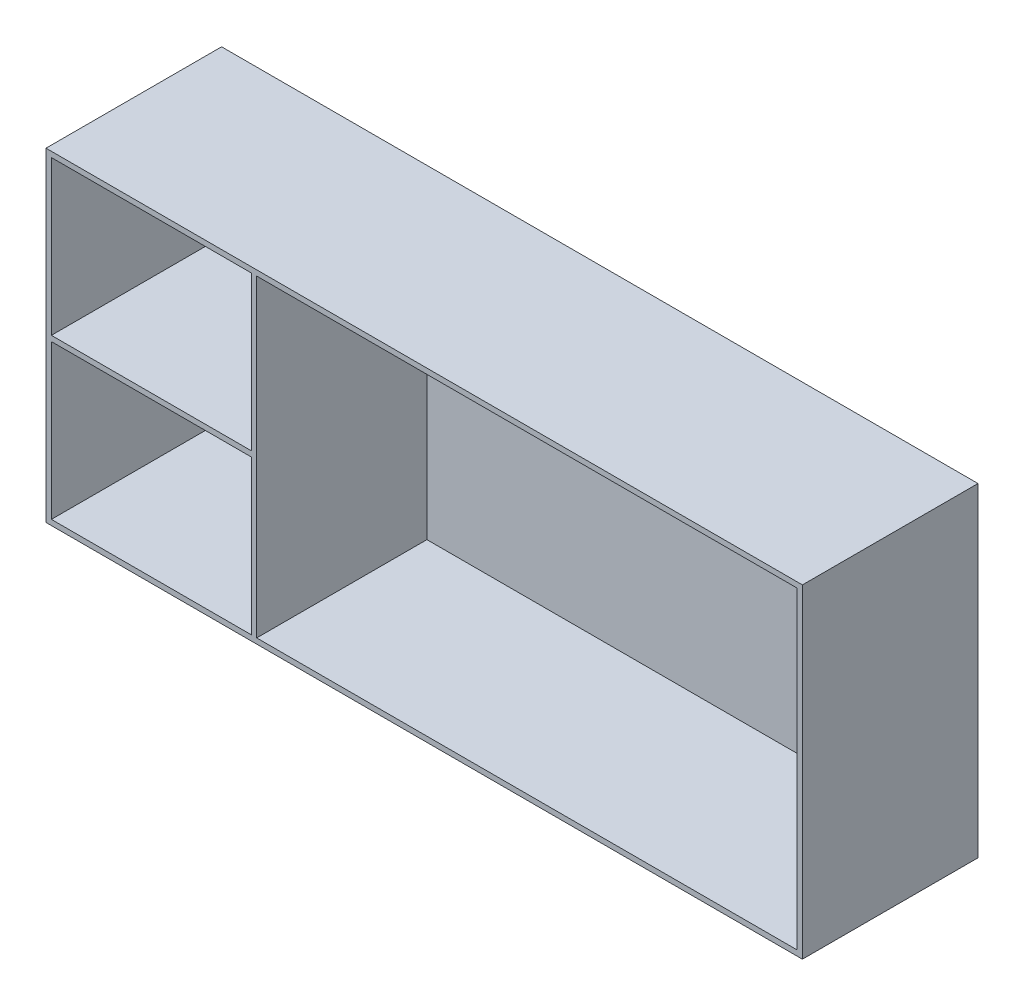
ISO-10303-21;
HEADER;
FILE_DESCRIPTION(('STEP AP214'),'2;1');
FILE_NAME('part.step','',(''),(''),'','','');
FILE_SCHEMA(('AUTOMOTIVE_DESIGN { 1 0 10303 214 1 1 1 1 }'));
ENDSEC;
DATA;
#1=APPLICATION_CONTEXT('core data for automotive mechanical design processes');
#2=APPLICATION_PROTOCOL_DEFINITION('international standard','automotive_design',2000,#1);
#3=PRODUCT_CONTEXT('',#1,'mechanical');
#4=PRODUCT('Part','Part','',(#3));
#5=PRODUCT_RELATED_PRODUCT_CATEGORY('part','',(#4));
#6=PRODUCT_DEFINITION_FORMATION('','',#4);
#7=PRODUCT_DEFINITION_CONTEXT('part definition',#1,'design');
#8=PRODUCT_DEFINITION('design','',#6,#7);
#9=PRODUCT_DEFINITION_SHAPE('','',#8);
#10=(LENGTH_UNIT() NAMED_UNIT(*) SI_UNIT(.MILLI.,.METRE.));
#11=(NAMED_UNIT(*) PLANE_ANGLE_UNIT() SI_UNIT($,.RADIAN.));
#12=(NAMED_UNIT(*) SI_UNIT($,.STERADIAN.) SOLID_ANGLE_UNIT());
#13=UNCERTAINTY_MEASURE_WITH_UNIT(LENGTH_MEASURE(1.E-05),#10,'distance_accuracy_value','');
#14=(GEOMETRIC_REPRESENTATION_CONTEXT(3) GLOBAL_UNCERTAINTY_ASSIGNED_CONTEXT((#13)) GLOBAL_UNIT_ASSIGNED_CONTEXT((#10,
#11,#12)) REPRESENTATION_CONTEXT('',''));
#15=CARTESIAN_POINT('',(0.,0.,0.));
#16=DIRECTION('',(0.,0.,1.));
#17=DIRECTION('',(1.,0.,0.));
#18=AXIS2_PLACEMENT_3D('',#15,#16,#17);
#19=CARTESIAN_POINT('',(0.,0.,65.));
#20=DIRECTION('',(0.,0.,-1.));
#21=DIRECTION('',(-1.,0.,0.));
#22=AXIS2_PLACEMENT_3D('',#19,#20,#21);
#23=PLANE('',#22);
#24=DIRECTION('',(1.,0.,0.));
#25=VECTOR('',#24,1.);
#26=CARTESIAN_POINT('',(0.,0.999999999999996,65.));
#27=LINE('',#26,#25);
#28=CARTESIAN_POINT('',(-138.,0.999999999999996,65.));
#29=VERTEX_POINT('',#28);
#30=CARTESIAN_POINT('',(-64.,0.999999999999996,65.));
#31=VERTEX_POINT('',#30);
#32=EDGE_CURVE('E175',#29,#31,#27,.T.);
#33=ORIENTED_EDGE('',*,*,#32,.F.);
#34=DIRECTION('',(0.,-1.,0.));
#35=VECTOR('',#34,1.);
#36=CARTESIAN_POINT('',(-138.,0.,65.));
#37=LINE('',#36,#35);
#38=CARTESIAN_POINT('',(-138.,58.,65.));
#39=VERTEX_POINT('',#38);
#40=EDGE_CURVE('E48',#39,#29,#37,.T.);
#41=ORIENTED_EDGE('',*,*,#40,.F.);
#42=DIRECTION('',(1.,0.,0.));
#43=VECTOR('',#42,1.);
#44=CARTESIAN_POINT('',(0.,58.,65.));
#45=LINE('',#44,#43);
#46=CARTESIAN_POINT('',(-64.,58.,65.));
#47=VERTEX_POINT('',#46);
#48=EDGE_CURVE('E166',#39,#47,#45,.T.);
#49=ORIENTED_EDGE('',*,*,#48,.T.);
#50=DIRECTION('',(0.,1.,0.));
#51=VECTOR('',#50,1.);
#52=CARTESIAN_POINT('',(-64.,0.,65.));
#53=LINE('',#52,#51);
#54=EDGE_CURVE('E169',#31,#47,#53,.T.);
#55=ORIENTED_EDGE('',*,*,#54,.F.);
#56=EDGE_LOOP('',(#33,#41,#49,#55));
#57=FACE_BOUND('',#56,.T.);
#58=DIRECTION('',(1.,0.,0.));
#59=VECTOR('',#58,1.);
#60=CARTESIAN_POINT('',(0.,-1.,65.));
#61=LINE('',#60,#59);
#62=CARTESIAN_POINT('',(-138.,-1.,65.));
#63=VERTEX_POINT('',#62);
#64=CARTESIAN_POINT('',(-64.,-1.,65.));
#65=VERTEX_POINT('',#64);
#66=EDGE_CURVE('E182',#63,#65,#61,.T.);
#67=ORIENTED_EDGE('',*,*,#66,.T.);
#68=DIRECTION('',(0.,1.,0.));
#69=VECTOR('',#68,1.);
#70=CARTESIAN_POINT('',(-64.,0.,65.));
#71=LINE('',#70,#69);
#72=CARTESIAN_POINT('',(-64.,-58.,65.));
#73=VERTEX_POINT('',#72);
#74=EDGE_CURVE('E216',#73,#65,#71,.T.);
#75=ORIENTED_EDGE('',*,*,#74,.F.);
#76=DIRECTION('',(1.,0.,0.));
#77=VECTOR('',#76,1.);
#78=CARTESIAN_POINT('',(0.,-58.,65.));
#79=LINE('',#78,#77);
#80=CARTESIAN_POINT('',(-138.,-58.,65.));
#81=VERTEX_POINT('',#80);
#82=EDGE_CURVE('E231',#81,#73,#79,.T.);
#83=ORIENTED_EDGE('',*,*,#82,.F.);
#84=DIRECTION('',(0.,-1.,0.));
#85=VECTOR('',#84,1.);
#86=CARTESIAN_POINT('',(-138.,0.,65.));
#87=LINE('',#86,#85);
#88=EDGE_CURVE('E228',#63,#81,#87,.T.);
#89=ORIENTED_EDGE('',*,*,#88,.F.);
#90=EDGE_LOOP('',(#67,#75,#83,#89));
#91=FACE_BOUND('',#90,.T.);
#92=DIRECTION('',(0.,-1.,0.));
#93=VECTOR('',#92,1.);
#94=CARTESIAN_POINT('',(-140.,60.,65.));
#95=LINE('',#94,#93);
#96=CARTESIAN_POINT('',(-140.,60.,65.));
#97=VERTEX_POINT('',#96);
#98=CARTESIAN_POINT('',(-140.,-60.,65.));
#99=VERTEX_POINT('',#98);
#100=EDGE_CURVE('E245',#97,#99,#95,.T.);
#101=ORIENTED_EDGE('',*,*,#100,.T.);
#102=DIRECTION('',(1.,0.,0.));
#103=VECTOR('',#102,1.);
#104=CARTESIAN_POINT('',(140.,-60.,65.));
#105=LINE('',#104,#103);
#106=CARTESIAN_POINT('',(140.,-60.,65.));
#107=VERTEX_POINT('',#106);
#108=EDGE_CURVE('E248',#99,#107,#105,.T.);
#109=ORIENTED_EDGE('',*,*,#108,.T.);
#110=DIRECTION('',(0.,1.,0.));
#111=VECTOR('',#110,1.);
#112=CARTESIAN_POINT('',(140.,60.,65.));
#113=LINE('',#112,#111);
#114=CARTESIAN_POINT('',(140.,60.,65.));
#115=VERTEX_POINT('',#114);
#116=EDGE_CURVE('E251',#107,#115,#113,.T.);
#117=ORIENTED_EDGE('',*,*,#116,.T.);
#118=DIRECTION('',(-1.,0.,0.));
#119=VECTOR('',#118,1.);
#120=CARTESIAN_POINT('',(140.,60.,65.));
#121=LINE('',#120,#119);
#122=EDGE_CURVE('E253',#115,#97,#121,.T.);
#123=ORIENTED_EDGE('',*,*,#122,.T.);
#124=EDGE_LOOP('',(#101,#109,#117,#123));
#125=FACE_BOUND('',#124,.T.);
#126=DIRECTION('',(0.,1.,0.));
#127=VECTOR('',#126,1.);
#128=CARTESIAN_POINT('',(-62.,0.,65.));
#129=LINE('',#128,#127);
#130=CARTESIAN_POINT('',(-62.,-58.,65.));
#131=VERTEX_POINT('',#130);
#132=CARTESIAN_POINT('',(-62.,58.,65.));
#133=VERTEX_POINT('',#132);
#134=EDGE_CURVE('E56',#131,#133,#129,.T.);
#135=ORIENTED_EDGE('',*,*,#134,.T.);
#136=DIRECTION('',(1.,0.,0.));
#137=VECTOR('',#136,1.);
#138=CARTESIAN_POINT('',(0.,58.,65.));
#139=LINE('',#138,#137);
#140=CARTESIAN_POINT('',(138.,58.,65.));
#141=VERTEX_POINT('',#140);
#142=EDGE_CURVE('E190',#133,#141,#139,.T.);
#143=ORIENTED_EDGE('',*,*,#142,.T.);
#144=DIRECTION('',(0.,-1.,0.));
#145=VECTOR('',#144,1.);
#146=CARTESIAN_POINT('',(138.,0.,65.));
#147=LINE('',#146,#145);
#148=CARTESIAN_POINT('',(138.,-58.,65.));
#149=VERTEX_POINT('',#148);
#150=EDGE_CURVE('E202',#141,#149,#147,.T.);
#151=ORIENTED_EDGE('',*,*,#150,.T.);
#152=DIRECTION('',(1.,0.,0.));
#153=VECTOR('',#152,1.);
#154=CARTESIAN_POINT('',(0.,-58.,65.));
#155=LINE('',#154,#153);
#156=EDGE_CURVE('E199',#131,#149,#155,.T.);
#157=ORIENTED_EDGE('',*,*,#156,.F.);
#158=EDGE_LOOP('',(#135,#143,#151,#157));
#159=FACE_BOUND('',#158,.T.);
#160=ADVANCED_FACE('F33',(#57,#91,#125,#159),#23,.F.);
#161=CARTESIAN_POINT('',(-140.,60.,65.));
#162=DIRECTION('',(1.,0.,0.));
#163=DIRECTION('',(0.,1.,0.));
#164=AXIS2_PLACEMENT_3D('',#161,#162,#163);
#165=PLANE('',#164);
#166=DIRECTION('',(0.,-1.,0.));
#167=VECTOR('',#166,1.);
#168=CARTESIAN_POINT('',(-140.,60.,0.));
#169=LINE('',#168,#167);
#170=CARTESIAN_POINT('',(-140.,60.,0.));
#171=VERTEX_POINT('',#170);
#172=CARTESIAN_POINT('',(-140.,-60.,0.));
#173=VERTEX_POINT('',#172);
#174=EDGE_CURVE('E238',#171,#173,#169,.T.);
#175=ORIENTED_EDGE('',*,*,#174,.T.);
#176=DIRECTION('',(0.,0.,-1.));
#177=VECTOR('',#176,1.);
#178=CARTESIAN_POINT('',(-140.,-60.,65.));
#179=LINE('',#178,#177);
#180=EDGE_CURVE('E11',#99,#173,#179,.T.);
#181=ORIENTED_EDGE('',*,*,#180,.F.);
#182=ORIENTED_EDGE('',*,*,#100,.F.);
#183=DIRECTION('',(0.,0.,-1.));
#184=VECTOR('',#183,1.);
#185=CARTESIAN_POINT('',(-140.,60.,65.));
#186=LINE('',#185,#184);
#187=EDGE_CURVE('E255',#97,#171,#186,.T.);
#188=ORIENTED_EDGE('',*,*,#187,.T.);
#189=EDGE_LOOP('',(#175,#181,#182,#188));
#190=FACE_BOUND('',#189,.T.);
#191=ADVANCED_FACE('F35',(#190),#165,.F.);
#192=CARTESIAN_POINT('',(140.,-60.,65.));
#193=DIRECTION('',(0.,1.,0.));
#194=DIRECTION('',(-1.,0.,0.));
#195=AXIS2_PLACEMENT_3D('',#192,#193,#194);
#196=PLANE('',#195);
#197=DIRECTION('',(1.,0.,0.));
#198=VECTOR('',#197,1.);
#199=CARTESIAN_POINT('',(140.,-60.,0.));
#200=LINE('',#199,#198);
#201=CARTESIAN_POINT('',(140.,-60.,0.));
#202=VERTEX_POINT('',#201);
#203=EDGE_CURVE('E258',#173,#202,#200,.T.);
#204=ORIENTED_EDGE('',*,*,#203,.T.);
#205=DIRECTION('',(0.,0.,-1.));
#206=VECTOR('',#205,1.);
#207=CARTESIAN_POINT('',(140.,-60.,65.));
#208=LINE('',#207,#206);
#209=EDGE_CURVE('E41',#107,#202,#208,.T.);
#210=ORIENTED_EDGE('',*,*,#209,.F.);
#211=ORIENTED_EDGE('',*,*,#108,.F.);
#212=ORIENTED_EDGE('',*,*,#180,.T.);
#213=EDGE_LOOP('',(#204,#210,#211,#212));
#214=FACE_BOUND('',#213,.T.);
#215=ADVANCED_FACE('F288',(#214),#196,.F.);
#216=CARTESIAN_POINT('',(140.,60.,65.));
#217=DIRECTION('',(-1.,0.,0.));
#218=DIRECTION('',(0.,0.,1.));
#219=AXIS2_PLACEMENT_3D('',#216,#217,#218);
#220=PLANE('',#219);
#221=DIRECTION('',(0.,1.,0.));
#222=VECTOR('',#221,1.);
#223=CARTESIAN_POINT('',(140.,60.,0.));
#224=LINE('',#223,#222);
#225=CARTESIAN_POINT('',(140.,60.,0.));
#226=VERTEX_POINT('',#225);
#227=EDGE_CURVE('E260',#202,#226,#224,.T.);
#228=ORIENTED_EDGE('',*,*,#227,.T.);
#229=DIRECTION('',(0.,0.,-1.));
#230=VECTOR('',#229,1.);
#231=CARTESIAN_POINT('',(140.,60.,65.));
#232=LINE('',#231,#230);
#233=EDGE_CURVE('E265',#115,#226,#232,.T.);
#234=ORIENTED_EDGE('',*,*,#233,.F.);
#235=ORIENTED_EDGE('',*,*,#116,.F.);
#236=ORIENTED_EDGE('',*,*,#209,.T.);
#237=EDGE_LOOP('',(#228,#234,#235,#236));
#238=FACE_BOUND('',#237,.T.);
#239=ADVANCED_FACE('F272',(#238),#220,.F.);
#240=CARTESIAN_POINT('',(140.,60.,65.));
#241=DIRECTION('',(0.,-1.,0.));
#242=DIRECTION('',(1.,0.,0.));
#243=AXIS2_PLACEMENT_3D('',#240,#241,#242);
#244=PLANE('',#243);
#245=DIRECTION('',(-1.,0.,0.));
#246=VECTOR('',#245,1.);
#247=CARTESIAN_POINT('',(140.,60.,0.));
#248=LINE('',#247,#246);
#249=EDGE_CURVE('E249',#226,#171,#248,.T.);
#250=ORIENTED_EDGE('',*,*,#249,.T.);
#251=ORIENTED_EDGE('',*,*,#187,.F.);
#252=ORIENTED_EDGE('',*,*,#122,.F.);
#253=ORIENTED_EDGE('',*,*,#233,.T.);
#254=EDGE_LOOP('',(#250,#251,#252,#253));
#255=FACE_BOUND('',#254,.T.);
#256=ADVANCED_FACE('F281',(#255),#244,.F.);
#257=CARTESIAN_POINT('',(0.,0.,0.));
#258=DIRECTION('',(0.,0.,-1.));
#259=DIRECTION('',(-1.,0.,0.));
#260=AXIS2_PLACEMENT_3D('',#257,#258,#259);
#261=PLANE('',#260);
#262=ORIENTED_EDGE('',*,*,#174,.F.);
#263=ORIENTED_EDGE('',*,*,#249,.F.);
#264=ORIENTED_EDGE('',*,*,#227,.F.);
#265=ORIENTED_EDGE('',*,*,#203,.F.);
#266=EDGE_LOOP('',(#262,#263,#264,#265));
#267=FACE_BOUND('',#266,.T.);
#268=ADVANCED_FACE('F278',(#267),#261,.T.);
#269=CARTESIAN_POINT('',(0.,-1.,2.));
#270=DIRECTION('',(0.,-1.,0.));
#271=DIRECTION('',(0.,0.,-1.));
#272=AXIS2_PLACEMENT_3D('',#269,#270,#271);
#273=PLANE('',#272);
#274=ORIENTED_EDGE('',*,*,#66,.F.);
#275=DIRECTION('',(0.,0.,1.));
#276=VECTOR('',#275,1.);
#277=CARTESIAN_POINT('',(-138.,-1.,2.));
#278=LINE('',#277,#276);
#279=CARTESIAN_POINT('',(-138.,-1.,2.));
#280=VERTEX_POINT('',#279);
#281=EDGE_CURVE('E225',#280,#63,#278,.T.);
#282=ORIENTED_EDGE('',*,*,#281,.F.);
#283=DIRECTION('',(1.,0.,0.));
#284=VECTOR('',#283,1.);
#285=CARTESIAN_POINT('',(0.,-1.,2.));
#286=LINE('',#285,#284);
#287=CARTESIAN_POINT('',(-64.,-1.,2.));
#288=VERTEX_POINT('',#287);
#289=EDGE_CURVE('E213',#280,#288,#286,.T.);
#290=ORIENTED_EDGE('',*,*,#289,.T.);
#291=DIRECTION('',(0.,0.,1.));
#292=VECTOR('',#291,1.);
#293=CARTESIAN_POINT('',(-64.,-1.,2.));
#294=LINE('',#293,#292);
#295=EDGE_CURVE('E236',#288,#65,#294,.T.);
#296=ORIENTED_EDGE('',*,*,#295,.T.);
#297=EDGE_LOOP('',(#274,#282,#290,#296));
#298=FACE_BOUND('',#297,.T.);
#299=ADVANCED_FACE('F303',(#298),#273,.T.);
#300=CARTESIAN_POINT('',(-64.,0.,2.));
#301=DIRECTION('',(1.,0.,0.));
#302=DIRECTION('',(0.,0.,-1.));
#303=AXIS2_PLACEMENT_3D('',#300,#301,#302);
#304=PLANE('',#303);
#305=ORIENTED_EDGE('',*,*,#74,.T.);
#306=ORIENTED_EDGE('',*,*,#295,.F.);
#307=DIRECTION('',(0.,1.,0.));
#308=VECTOR('',#307,1.);
#309=CARTESIAN_POINT('',(-64.,0.,2.));
#310=LINE('',#309,#308);
#311=CARTESIAN_POINT('',(-64.,-58.,2.));
#312=VERTEX_POINT('',#311);
#313=EDGE_CURVE('E222',#312,#288,#310,.T.);
#314=ORIENTED_EDGE('',*,*,#313,.F.);
#315=DIRECTION('',(0.,0.,1.));
#316=VECTOR('',#315,1.);
#317=CARTESIAN_POINT('',(-64.,-58.,2.));
#318=LINE('',#317,#316);
#319=EDGE_CURVE('E239',#312,#73,#318,.T.);
#320=ORIENTED_EDGE('',*,*,#319,.T.);
#321=EDGE_LOOP('',(#305,#306,#314,#320));
#322=FACE_BOUND('',#321,.T.);
#323=ADVANCED_FACE('F322',(#322),#304,.F.);
#324=CARTESIAN_POINT('',(0.,-58.,2.));
#325=DIRECTION('',(0.,-1.,0.));
#326=DIRECTION('',(0.,0.,-1.));
#327=AXIS2_PLACEMENT_3D('',#324,#325,#326);
#328=PLANE('',#327);
#329=ORIENTED_EDGE('',*,*,#82,.T.);
#330=ORIENTED_EDGE('',*,*,#319,.F.);
#331=DIRECTION('',(1.,0.,0.));
#332=VECTOR('',#331,1.);
#333=CARTESIAN_POINT('',(0.,-58.,2.));
#334=LINE('',#333,#332);
#335=CARTESIAN_POINT('',(-138.,-58.,2.));
#336=VERTEX_POINT('',#335);
#337=EDGE_CURVE('E219',#336,#312,#334,.T.);
#338=ORIENTED_EDGE('',*,*,#337,.F.);
#339=DIRECTION('',(0.,0.,1.));
#340=VECTOR('',#339,1.);
#341=CARTESIAN_POINT('',(-138.,-58.,2.));
#342=LINE('',#341,#340);
#343=EDGE_CURVE('E241',#336,#81,#342,.T.);
#344=ORIENTED_EDGE('',*,*,#343,.T.);
#345=EDGE_LOOP('',(#329,#330,#338,#344));
#346=FACE_BOUND('',#345,.T.);
#347=ADVANCED_FACE('F329',(#346),#328,.F.);
#348=CARTESIAN_POINT('',(-138.,0.,2.));
#349=DIRECTION('',(-1.,0.,0.));
#350=DIRECTION('',(0.,-1.,0.));
#351=AXIS2_PLACEMENT_3D('',#348,#349,#350);
#352=PLANE('',#351);
#353=ORIENTED_EDGE('',*,*,#88,.T.);
#354=ORIENTED_EDGE('',*,*,#343,.F.);
#355=DIRECTION('',(0.,-1.,0.));
#356=VECTOR('',#355,1.);
#357=CARTESIAN_POINT('',(-138.,0.,2.));
#358=LINE('',#357,#356);
#359=EDGE_CURVE('E215',#280,#336,#358,.T.);
#360=ORIENTED_EDGE('',*,*,#359,.F.);
#361=ORIENTED_EDGE('',*,*,#281,.T.);
#362=EDGE_LOOP('',(#353,#354,#360,#361));
#363=FACE_BOUND('',#362,.T.);
#364=ADVANCED_FACE('F337',(#363),#352,.F.);
#365=CARTESIAN_POINT('',(0.,0.,2.));
#366=DIRECTION('',(0.,0.,1.));
#367=DIRECTION('',(1.,0.,0.));
#368=AXIS2_PLACEMENT_3D('',#365,#366,#367);
#369=PLANE('',#368);
#370=ORIENTED_EDGE('',*,*,#289,.F.);
#371=ORIENTED_EDGE('',*,*,#359,.T.);
#372=ORIENTED_EDGE('',*,*,#337,.T.);
#373=ORIENTED_EDGE('',*,*,#313,.T.);
#374=EDGE_LOOP('',(#370,#371,#372,#373));
#375=FACE_BOUND('',#374,.T.);
#376=ADVANCED_FACE('F345',(#375),#369,.T.);
#377=CARTESIAN_POINT('',(-62.,0.,2.));
#378=DIRECTION('',(1.,0.,0.));
#379=DIRECTION('',(0.,0.,-1.));
#380=AXIS2_PLACEMENT_3D('',#377,#378,#379);
#381=PLANE('',#380);
#382=ORIENTED_EDGE('',*,*,#134,.F.);
#383=DIRECTION('',(0.,0.,1.));
#384=VECTOR('',#383,1.);
#385=CARTESIAN_POINT('',(-62.,-58.,2.));
#386=LINE('',#385,#384);
#387=CARTESIAN_POINT('',(-62.,-58.,2.));
#388=VERTEX_POINT('',#387);
#389=EDGE_CURVE('E197',#388,#131,#386,.T.);
#390=ORIENTED_EDGE('',*,*,#389,.F.);
#391=DIRECTION('',(0.,1.,0.));
#392=VECTOR('',#391,1.);
#393=CARTESIAN_POINT('',(-62.,0.,2.));
#394=LINE('',#393,#392);
#395=CARTESIAN_POINT('',(-62.,58.,2.));
#396=VERTEX_POINT('',#395);
#397=EDGE_CURVE('E186',#388,#396,#394,.T.);
#398=ORIENTED_EDGE('',*,*,#397,.T.);
#399=DIRECTION('',(0.,0.,1.));
#400=VECTOR('',#399,1.);
#401=CARTESIAN_POINT('',(-62.,58.,2.));
#402=LINE('',#401,#400);
#403=EDGE_CURVE('E176',#396,#133,#402,.T.);
#404=ORIENTED_EDGE('',*,*,#403,.T.);
#405=EDGE_LOOP('',(#382,#390,#398,#404));
#406=FACE_BOUND('',#405,.T.);
#407=ADVANCED_FACE('F352',(#406),#381,.T.);
#408=CARTESIAN_POINT('',(0.,58.,2.));
#409=DIRECTION('',(0.,-1.,0.));
#410=DIRECTION('',(0.,0.,-1.));
#411=AXIS2_PLACEMENT_3D('',#408,#409,#410);
#412=PLANE('',#411);
#413=ORIENTED_EDGE('',*,*,#142,.F.);
#414=ORIENTED_EDGE('',*,*,#403,.F.);
#415=DIRECTION('',(1.,0.,0.));
#416=VECTOR('',#415,1.);
#417=CARTESIAN_POINT('',(0.,58.,2.));
#418=LINE('',#417,#416);
#419=CARTESIAN_POINT('',(138.,58.,2.));
#420=VERTEX_POINT('',#419);
#421=EDGE_CURVE('E195',#396,#420,#418,.T.);
#422=ORIENTED_EDGE('',*,*,#421,.T.);
#423=DIRECTION('',(0.,0.,1.));
#424=VECTOR('',#423,1.);
#425=CARTESIAN_POINT('',(138.,58.,2.));
#426=LINE('',#425,#424);
#427=EDGE_CURVE('E208',#420,#141,#426,.T.);
#428=ORIENTED_EDGE('',*,*,#427,.T.);
#429=EDGE_LOOP('',(#413,#414,#422,#428));
#430=FACE_BOUND('',#429,.T.);
#431=ADVANCED_FACE('F360',(#430),#412,.T.);
#432=CARTESIAN_POINT('',(138.,0.,2.));
#433=DIRECTION('',(-1.,0.,0.));
#434=DIRECTION('',(0.,-1.,0.));
#435=AXIS2_PLACEMENT_3D('',#432,#433,#434);
#436=PLANE('',#435);
#437=ORIENTED_EDGE('',*,*,#150,.F.);
#438=ORIENTED_EDGE('',*,*,#427,.F.);
#439=DIRECTION('',(0.,-1.,0.));
#440=VECTOR('',#439,1.);
#441=CARTESIAN_POINT('',(138.,0.,2.));
#442=LINE('',#441,#440);
#443=CARTESIAN_POINT('',(138.,-58.,2.));
#444=VERTEX_POINT('',#443);
#445=EDGE_CURVE('E193',#420,#444,#442,.T.);
#446=ORIENTED_EDGE('',*,*,#445,.T.);
#447=DIRECTION('',(0.,0.,1.));
#448=VECTOR('',#447,1.);
#449=CARTESIAN_POINT('',(138.,-58.,2.));
#450=LINE('',#449,#448);
#451=EDGE_CURVE('E210',#444,#149,#450,.T.);
#452=ORIENTED_EDGE('',*,*,#451,.T.);
#453=EDGE_LOOP('',(#437,#438,#446,#452));
#454=FACE_BOUND('',#453,.T.);
#455=ADVANCED_FACE('F367',(#454),#436,.T.);
#456=CARTESIAN_POINT('',(0.,-58.,2.));
#457=DIRECTION('',(0.,-1.,0.));
#458=DIRECTION('',(0.,0.,-1.));
#459=AXIS2_PLACEMENT_3D('',#456,#457,#458);
#460=PLANE('',#459);
#461=ORIENTED_EDGE('',*,*,#156,.T.);
#462=ORIENTED_EDGE('',*,*,#451,.F.);
#463=DIRECTION('',(1.,0.,0.));
#464=VECTOR('',#463,1.);
#465=CARTESIAN_POINT('',(0.,-58.,2.));
#466=LINE('',#465,#464);
#467=EDGE_CURVE('E189',#388,#444,#466,.T.);
#468=ORIENTED_EDGE('',*,*,#467,.F.);
#469=ORIENTED_EDGE('',*,*,#389,.T.);
#470=EDGE_LOOP('',(#461,#462,#468,#469));
#471=FACE_BOUND('',#470,.T.);
#472=ADVANCED_FACE('F375',(#471),#460,.F.);
#473=CARTESIAN_POINT('',(0.,0.,2.));
#474=DIRECTION('',(0.,0.,1.));
#475=DIRECTION('',(1.,0.,0.));
#476=AXIS2_PLACEMENT_3D('',#473,#474,#475);
#477=PLANE('',#476);
#478=ORIENTED_EDGE('',*,*,#397,.F.);
#479=ORIENTED_EDGE('',*,*,#467,.T.);
#480=ORIENTED_EDGE('',*,*,#445,.F.);
#481=ORIENTED_EDGE('',*,*,#421,.F.);
#482=EDGE_LOOP('',(#478,#479,#480,#481));
#483=FACE_BOUND('',#482,.T.);
#484=ADVANCED_FACE('F383',(#483),#477,.T.);
#485=CARTESIAN_POINT('',(-138.,0.,2.));
#486=DIRECTION('',(-1.,0.,0.));
#487=DIRECTION('',(0.,-1.,0.));
#488=AXIS2_PLACEMENT_3D('',#485,#486,#487);
#489=PLANE('',#488);
#490=ORIENTED_EDGE('',*,*,#40,.T.);
#491=DIRECTION('',(0.,0.,1.));
#492=VECTOR('',#491,1.);
#493=CARTESIAN_POINT('',(-138.,0.999999999999996,2.));
#494=LINE('',#493,#492);
#495=CARTESIAN_POINT('',(-138.,0.999999999999996,2.));
#496=VERTEX_POINT('',#495);
#497=EDGE_CURVE('E145',#496,#29,#494,.T.);
#498=ORIENTED_EDGE('',*,*,#497,.F.);
#499=DIRECTION('',(0.,-1.,0.));
#500=VECTOR('',#499,1.);
#501=CARTESIAN_POINT('',(-138.,0.,2.));
#502=LINE('',#501,#500);
#503=CARTESIAN_POINT('',(-138.,58.,2.));
#504=VERTEX_POINT('',#503);
#505=EDGE_CURVE('E149',#504,#496,#502,.T.);
#506=ORIENTED_EDGE('',*,*,#505,.F.);
#507=DIRECTION('',(0.,0.,1.));
#508=VECTOR('',#507,1.);
#509=CARTESIAN_POINT('',(-138.,58.,2.));
#510=LINE('',#509,#508);
#511=EDGE_CURVE('E180',#504,#39,#510,.T.);
#512=ORIENTED_EDGE('',*,*,#511,.T.);
#513=EDGE_LOOP('',(#490,#498,#506,#512));
#514=FACE_BOUND('',#513,.T.);
#515=ADVANCED_FACE('F147',(#514),#489,.F.);
#516=CARTESIAN_POINT('',(0.,58.,2.));
#517=DIRECTION('',(0.,-1.,0.));
#518=DIRECTION('',(0.,0.,-1.));
#519=AXIS2_PLACEMENT_3D('',#516,#517,#518);
#520=PLANE('',#519);
#521=ORIENTED_EDGE('',*,*,#48,.F.);
#522=ORIENTED_EDGE('',*,*,#511,.F.);
#523=DIRECTION('',(1.,0.,0.));
#524=VECTOR('',#523,1.);
#525=CARTESIAN_POINT('',(0.,58.,2.));
#526=LINE('',#525,#524);
#527=CARTESIAN_POINT('',(-64.,58.,2.));
#528=VERTEX_POINT('',#527);
#529=EDGE_CURVE('E154',#504,#528,#526,.T.);
#530=ORIENTED_EDGE('',*,*,#529,.T.);
#531=DIRECTION('',(0.,0.,1.));
#532=VECTOR('',#531,1.);
#533=CARTESIAN_POINT('',(-64.,58.,2.));
#534=LINE('',#533,#532);
#535=EDGE_CURVE('E183',#528,#47,#534,.T.);
#536=ORIENTED_EDGE('',*,*,#535,.T.);
#537=EDGE_LOOP('',(#521,#522,#530,#536));
#538=FACE_BOUND('',#537,.T.);
#539=ADVANCED_FACE('F398',(#538),#520,.T.);
#540=CARTESIAN_POINT('',(-64.,0.,2.));
#541=DIRECTION('',(1.,0.,0.));
#542=DIRECTION('',(0.,0.,-1.));
#543=AXIS2_PLACEMENT_3D('',#540,#541,#542);
#544=PLANE('',#543);
#545=ORIENTED_EDGE('',*,*,#54,.T.);
#546=ORIENTED_EDGE('',*,*,#535,.F.);
#547=DIRECTION('',(0.,1.,0.));
#548=VECTOR('',#547,1.);
#549=CARTESIAN_POINT('',(-64.,0.,2.));
#550=LINE('',#549,#548);
#551=CARTESIAN_POINT('',(-64.,0.999999999999996,2.));
#552=VERTEX_POINT('',#551);
#553=EDGE_CURVE('E162',#552,#528,#550,.T.);
#554=ORIENTED_EDGE('',*,*,#553,.F.);
#555=DIRECTION('',(0.,0.,1.));
#556=VECTOR('',#555,1.);
#557=CARTESIAN_POINT('',(-64.,0.999999999999996,2.));
#558=LINE('',#557,#556);
#559=EDGE_CURVE('E153',#552,#31,#558,.T.);
#560=ORIENTED_EDGE('',*,*,#559,.T.);
#561=EDGE_LOOP('',(#545,#546,#554,#560));
#562=FACE_BOUND('',#561,.T.);
#563=ADVANCED_FACE('F405',(#562),#544,.F.);
#564=CARTESIAN_POINT('',(0.,0.999999999999996,2.));
#565=DIRECTION('',(0.,-1.,0.));
#566=DIRECTION('',(0.,0.,-1.));
#567=AXIS2_PLACEMENT_3D('',#564,#565,#566);
#568=PLANE('',#567);
#569=ORIENTED_EDGE('',*,*,#32,.T.);
#570=ORIENTED_EDGE('',*,*,#559,.F.);
#571=DIRECTION('',(1.,0.,0.));
#572=VECTOR('',#571,1.);
#573=CARTESIAN_POINT('',(0.,0.999999999999996,2.));
#574=LINE('',#573,#572);
#575=EDGE_CURVE('E157',#496,#552,#574,.T.);
#576=ORIENTED_EDGE('',*,*,#575,.F.);
#577=ORIENTED_EDGE('',*,*,#497,.T.);
#578=EDGE_LOOP('',(#569,#570,#576,#577));
#579=FACE_BOUND('',#578,.T.);
#580=ADVANCED_FACE('F158',(#579),#568,.F.);
#581=CARTESIAN_POINT('',(0.,0.,2.));
#582=DIRECTION('',(0.,0.,1.));
#583=DIRECTION('',(1.,0.,0.));
#584=AXIS2_PLACEMENT_3D('',#581,#582,#583);
#585=PLANE('',#584);
#586=ORIENTED_EDGE('',*,*,#505,.T.);
#587=ORIENTED_EDGE('',*,*,#575,.T.);
#588=ORIENTED_EDGE('',*,*,#553,.T.);
#589=ORIENTED_EDGE('',*,*,#529,.F.);
#590=EDGE_LOOP('',(#586,#587,#588,#589));
#591=FACE_BOUND('',#590,.T.);
#592=ADVANCED_FACE('F165',(#591),#585,.T.);
#593=CLOSED_SHELL('',(#160,#191,#215,#239,#256,#268,#299,#323,#347,#364,#376,#407,#431,#455,
#472,#484,#515,#539,#563,#580,#592));
#594=MANIFOLD_SOLID_BREP('B2',#593);
#595=ADVANCED_BREP_SHAPE_REPRESENTATION('',(#18,#594),#14);
#596=SHAPE_DEFINITION_REPRESENTATION(#9,#595);
ENDSEC;
END-ISO-10303-21;
